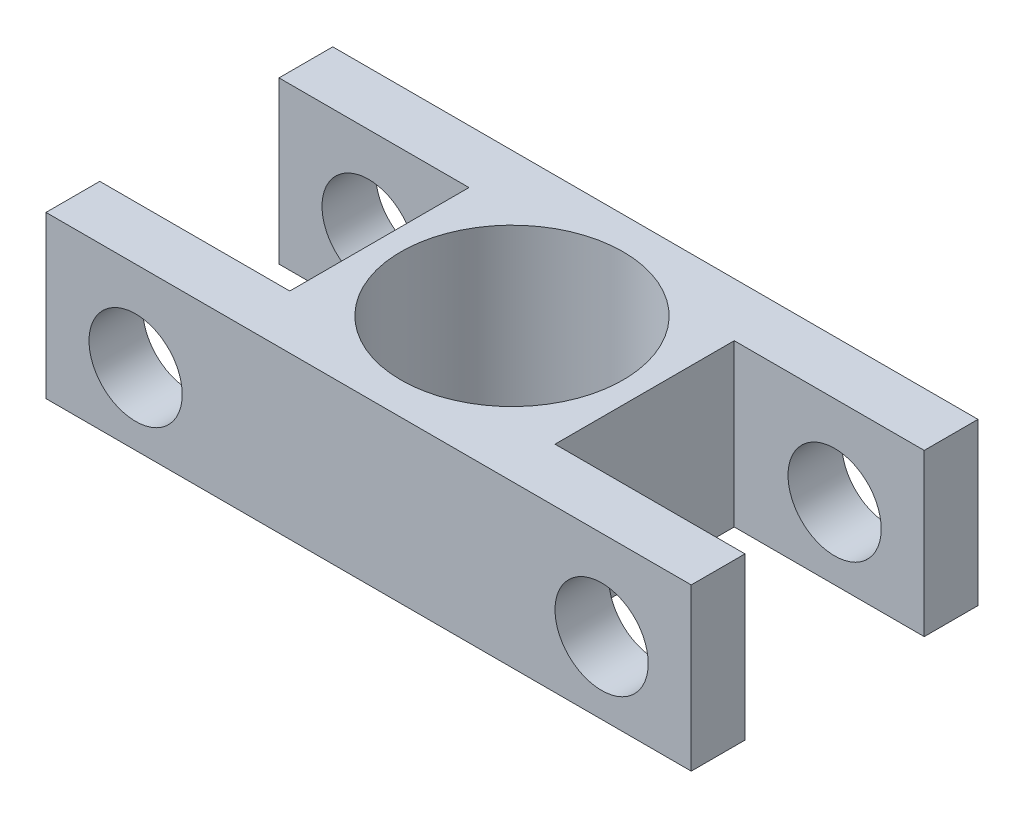
ISO-10303-21;
HEADER;
FILE_DESCRIPTION(('STEP AP214'),'2;1');
FILE_NAME('part.step','',(''),(''),'','','');
FILE_SCHEMA(('AUTOMOTIVE_DESIGN { 1 0 10303 214 1 1 1 1 }'));
ENDSEC;
DATA;
#1=APPLICATION_CONTEXT('core data for automotive mechanical design processes');
#2=APPLICATION_PROTOCOL_DEFINITION('international standard','automotive_design',2000,#1);
#3=PRODUCT_CONTEXT('',#1,'mechanical');
#4=PRODUCT('Part','Part','',(#3));
#5=PRODUCT_RELATED_PRODUCT_CATEGORY('part','',(#4));
#6=PRODUCT_DEFINITION_FORMATION('','',#4);
#7=PRODUCT_DEFINITION_CONTEXT('part definition',#1,'design');
#8=PRODUCT_DEFINITION('design','',#6,#7);
#9=PRODUCT_DEFINITION_SHAPE('','',#8);
#10=(LENGTH_UNIT() NAMED_UNIT(*) SI_UNIT(.MILLI.,.METRE.));
#11=(NAMED_UNIT(*) PLANE_ANGLE_UNIT() SI_UNIT($,.RADIAN.));
#12=(NAMED_UNIT(*) SI_UNIT($,.STERADIAN.) SOLID_ANGLE_UNIT());
#13=UNCERTAINTY_MEASURE_WITH_UNIT(LENGTH_MEASURE(1.E-05),#10,'distance_accuracy_value','');
#14=(GEOMETRIC_REPRESENTATION_CONTEXT(3) GLOBAL_UNCERTAINTY_ASSIGNED_CONTEXT((#13)) GLOBAL_UNIT_ASSIGNED_CONTEXT((#10,
#11,#12)) REPRESENTATION_CONTEXT('',''));
#15=CARTESIAN_POINT('',(0.,0.,0.));
#16=DIRECTION('',(0.,0.,1.));
#17=DIRECTION('',(1.,0.,0.));
#18=AXIS2_PLACEMENT_3D('',#15,#16,#17);
#19=CARTESIAN_POINT('',(0.,0.,16.));
#20=DIRECTION('',(0.,1.,0.));
#21=DIRECTION('',(0.,0.,1.));
#22=AXIS2_PLACEMENT_3D('',#19,#20,#21);
#23=PLANE('',#22);
#24=CARTESIAN_POINT('',(18.,0.,8.));
#25=DIRECTION('',(0.,1.,0.));
#26=DIRECTION('',(0.,0.,1.));
#27=AXIS2_PLACEMENT_3D('',#24,#25,#26);
#28=CIRCLE('',#27,6.2);
#29=CARTESIAN_POINT('',(18.,0.,14.2));
#30=VERTEX_POINT('',#29);
#31=EDGE_CURVE('E241',#30,#30,#28,.T.);
#32=ORIENTED_EDGE('',*,*,#31,.T.);
#33=EDGE_LOOP('',(#32));
#34=FACE_BOUND('',#33,.T.);
#35=DIRECTION('',(1.,0.,0.));
#36=VECTOR('',#35,1.);
#37=CARTESIAN_POINT('',(0.,0.,3.));
#38=LINE('',#37,#36);
#39=CARTESIAN_POINT('',(25.4,0.,3.));
#40=VERTEX_POINT('',#39);
#41=CARTESIAN_POINT('',(36.,0.,3.));
#42=VERTEX_POINT('',#41);
#43=EDGE_CURVE('E154',#40,#42,#38,.T.);
#44=ORIENTED_EDGE('',*,*,#43,.F.);
#45=DIRECTION('',(0.,0.,1.));
#46=VECTOR('',#45,1.);
#47=CARTESIAN_POINT('',(25.4,0.,16.));
#48=LINE('',#47,#46);
#49=CARTESIAN_POINT('',(25.4,0.,13.));
#50=VERTEX_POINT('',#49);
#51=EDGE_CURVE('E156',#40,#50,#48,.T.);
#52=ORIENTED_EDGE('',*,*,#51,.T.);
#53=DIRECTION('',(1.,0.,0.));
#54=VECTOR('',#53,1.);
#55=CARTESIAN_POINT('',(0.,0.,13.));
#56=LINE('',#55,#54);
#57=CARTESIAN_POINT('',(36.,0.,13.));
#58=VERTEX_POINT('',#57);
#59=EDGE_CURVE('E140',#50,#58,#56,.T.);
#60=ORIENTED_EDGE('',*,*,#59,.T.);
#61=DIRECTION('',(0.,0.,-1.));
#62=VECTOR('',#61,1.);
#63=CARTESIAN_POINT('',(36.,0.,16.));
#64=LINE('',#63,#62);
#65=CARTESIAN_POINT('',(36.,0.,16.));
#66=VERTEX_POINT('',#65);
#67=EDGE_CURVE('E203',#66,#58,#64,.T.);
#68=ORIENTED_EDGE('',*,*,#67,.F.);
#69=DIRECTION('',(1.,0.,0.));
#70=VECTOR('',#69,1.);
#71=CARTESIAN_POINT('',(0.,0.,16.));
#72=LINE('',#71,#70);
#73=CARTESIAN_POINT('',(0.,0.,16.));
#74=VERTEX_POINT('',#73);
#75=EDGE_CURVE('E179',#74,#66,#72,.T.);
#76=ORIENTED_EDGE('',*,*,#75,.F.);
#77=DIRECTION('',(0.,0.,-1.));
#78=VECTOR('',#77,1.);
#79=CARTESIAN_POINT('',(0.,0.,16.));
#80=LINE('',#79,#78);
#81=CARTESIAN_POINT('',(0.,0.,13.));
#82=VERTEX_POINT('',#81);
#83=EDGE_CURVE('E207',#74,#82,#80,.T.);
#84=ORIENTED_EDGE('',*,*,#83,.T.);
#85=DIRECTION('',(1.,0.,0.));
#86=VECTOR('',#85,1.);
#87=CARTESIAN_POINT('',(0.,0.,13.));
#88=LINE('',#87,#86);
#89=CARTESIAN_POINT('',(10.6,0.,13.));
#90=VERTEX_POINT('',#89);
#91=EDGE_CURVE('E165',#82,#90,#88,.T.);
#92=ORIENTED_EDGE('',*,*,#91,.T.);
#93=DIRECTION('',(0.,0.,-1.));
#94=VECTOR('',#93,1.);
#95=CARTESIAN_POINT('',(10.6,0.,16.));
#96=LINE('',#95,#94);
#97=CARTESIAN_POINT('',(10.6,0.,3.));
#98=VERTEX_POINT('',#97);
#99=EDGE_CURVE('E172',#90,#98,#96,.T.);
#100=ORIENTED_EDGE('',*,*,#99,.T.);
#101=DIRECTION('',(1.,0.,0.));
#102=VECTOR('',#101,1.);
#103=CARTESIAN_POINT('',(0.,0.,3.));
#104=LINE('',#103,#102);
#105=CARTESIAN_POINT('',(0.,0.,3.));
#106=VERTEX_POINT('',#105);
#107=EDGE_CURVE('E170',#106,#98,#104,.T.);
#108=ORIENTED_EDGE('',*,*,#107,.F.);
#109=CARTESIAN_POINT('',(0.,0.,0.));
#110=VERTEX_POINT('',#109);
#111=EDGE_CURVE('E206',#106,#110,#80,.T.);
#112=ORIENTED_EDGE('',*,*,#111,.T.);
#113=DIRECTION('',(1.,0.,0.));
#114=VECTOR('',#113,1.);
#115=CARTESIAN_POINT('',(0.,0.,0.));
#116=LINE('',#115,#114);
#117=CARTESIAN_POINT('',(36.,0.,0.));
#118=VERTEX_POINT('',#117);
#119=EDGE_CURVE('E189',#110,#118,#116,.T.);
#120=ORIENTED_EDGE('',*,*,#119,.T.);
#121=EDGE_CURVE('E202',#42,#118,#64,.T.);
#122=ORIENTED_EDGE('',*,*,#121,.F.);
#123=EDGE_LOOP('',(#44,#52,#60,#68,#76,#84,#92,#100,#108,#112,#120,#122));
#124=FACE_BOUND('',#123,.T.);
#125=ADVANCED_FACE('F39',(#34,#124),#23,.F.);
#126=CARTESIAN_POINT('',(36.,9.,16.));
#127=DIRECTION('',(0.,-1.,0.));
#128=DIRECTION('',(0.,0.,-1.));
#129=AXIS2_PLACEMENT_3D('',#126,#127,#128);
#130=PLANE('',#129);
#131=CARTESIAN_POINT('',(18.,9.,8.));
#132=DIRECTION('',(0.,1.,0.));
#133=DIRECTION('',(0.,0.,1.));
#134=AXIS2_PLACEMENT_3D('',#131,#132,#133);
#135=CIRCLE('',#134,6.2);
#136=CARTESIAN_POINT('',(18.,9.,14.2));
#137=VERTEX_POINT('',#136);
#138=EDGE_CURVE('E244',#137,#137,#135,.T.);
#139=ORIENTED_EDGE('',*,*,#138,.F.);
#140=EDGE_LOOP('',(#139));
#141=FACE_BOUND('',#140,.T.);
#142=DIRECTION('',(-1.,0.,0.));
#143=VECTOR('',#142,1.);
#144=CARTESIAN_POINT('',(36.,9.,3.));
#145=LINE('',#144,#143);
#146=CARTESIAN_POINT('',(36.,9.,3.));
#147=VERTEX_POINT('',#146);
#148=CARTESIAN_POINT('',(25.4,9.,3.));
#149=VERTEX_POINT('',#148);
#150=EDGE_CURVE('E149',#147,#149,#145,.T.);
#151=ORIENTED_EDGE('',*,*,#150,.F.);
#152=DIRECTION('',(0.,0.,-1.));
#153=VECTOR('',#152,1.);
#154=CARTESIAN_POINT('',(36.,9.,16.));
#155=LINE('',#154,#153);
#156=CARTESIAN_POINT('',(36.,9.,0.));
#157=VERTEX_POINT('',#156);
#158=EDGE_CURVE('E200',#147,#157,#155,.T.);
#159=ORIENTED_EDGE('',*,*,#158,.T.);
#160=DIRECTION('',(-1.,0.,0.));
#161=VECTOR('',#160,1.);
#162=CARTESIAN_POINT('',(36.,9.,0.));
#163=LINE('',#162,#161);
#164=CARTESIAN_POINT('',(0.,9.,0.));
#165=VERTEX_POINT('',#164);
#166=EDGE_CURVE('E180',#157,#165,#163,.T.);
#167=ORIENTED_EDGE('',*,*,#166,.T.);
#168=DIRECTION('',(0.,0.,-1.));
#169=VECTOR('',#168,1.);
#170=CARTESIAN_POINT('',(0.,9.,16.));
#171=LINE('',#170,#169);
#172=CARTESIAN_POINT('',(0.,9.,3.));
#173=VERTEX_POINT('',#172);
#174=EDGE_CURVE('E186',#173,#165,#171,.T.);
#175=ORIENTED_EDGE('',*,*,#174,.F.);
#176=DIRECTION('',(-1.,0.,0.));
#177=VECTOR('',#176,1.);
#178=CARTESIAN_POINT('',(36.,9.,3.));
#179=LINE('',#178,#177);
#180=CARTESIAN_POINT('',(10.6,9.,3.));
#181=VERTEX_POINT('',#180);
#182=EDGE_CURVE('E215',#181,#173,#179,.T.);
#183=ORIENTED_EDGE('',*,*,#182,.F.);
#184=DIRECTION('',(0.,0.,1.));
#185=VECTOR('',#184,1.);
#186=CARTESIAN_POINT('',(10.6,9.,16.));
#187=LINE('',#186,#185);
#188=CARTESIAN_POINT('',(10.6,9.,13.));
#189=VERTEX_POINT('',#188);
#190=EDGE_CURVE('E212',#181,#189,#187,.T.);
#191=ORIENTED_EDGE('',*,*,#190,.T.);
#192=DIRECTION('',(-1.,0.,0.));
#193=VECTOR('',#192,1.);
#194=CARTESIAN_POINT('',(36.,9.,13.));
#195=LINE('',#194,#193);
#196=CARTESIAN_POINT('',(0.,9.,13.));
#197=VERTEX_POINT('',#196);
#198=EDGE_CURVE('E210',#189,#197,#195,.T.);
#199=ORIENTED_EDGE('',*,*,#198,.T.);
#200=CARTESIAN_POINT('',(0.,9.,16.));
#201=VERTEX_POINT('',#200);
#202=EDGE_CURVE('E197',#201,#197,#171,.T.);
#203=ORIENTED_EDGE('',*,*,#202,.F.);
#204=DIRECTION('',(-1.,0.,0.));
#205=VECTOR('',#204,1.);
#206=CARTESIAN_POINT('',(36.,9.,16.));
#207=LINE('',#206,#205);
#208=CARTESIAN_POINT('',(36.,9.,16.));
#209=VERTEX_POINT('',#208);
#210=EDGE_CURVE('E184',#209,#201,#207,.T.);
#211=ORIENTED_EDGE('',*,*,#210,.F.);
#212=CARTESIAN_POINT('',(36.,9.,13.));
#213=VERTEX_POINT('',#212);
#214=EDGE_CURVE('E147',#209,#213,#155,.T.);
#215=ORIENTED_EDGE('',*,*,#214,.T.);
#216=DIRECTION('',(-1.,0.,0.));
#217=VECTOR('',#216,1.);
#218=CARTESIAN_POINT('',(36.,9.,13.));
#219=LINE('',#218,#217);
#220=CARTESIAN_POINT('',(25.4,9.,13.));
#221=VERTEX_POINT('',#220);
#222=EDGE_CURVE('E56',#213,#221,#219,.T.);
#223=ORIENTED_EDGE('',*,*,#222,.T.);
#224=DIRECTION('',(0.,0.,-1.));
#225=VECTOR('',#224,1.);
#226=CARTESIAN_POINT('',(25.4,9.,16.));
#227=LINE('',#226,#225);
#228=EDGE_CURVE('E11',#221,#149,#227,.T.);
#229=ORIENTED_EDGE('',*,*,#228,.T.);
#230=EDGE_LOOP('',(#151,#159,#167,#175,#183,#191,#199,#203,#211,#215,#223,#229));
#231=FACE_BOUND('',#230,.T.);
#232=ADVANCED_FACE('F144',(#141,#231),#130,.F.);
#233=CARTESIAN_POINT('',(36.,0.,16.));
#234=DIRECTION('',(-1.,0.,0.));
#235=DIRECTION('',(0.,0.,1.));
#236=AXIS2_PLACEMENT_3D('',#233,#234,#235);
#237=PLANE('',#236);
#238=DIRECTION('',(0.,1.,0.));
#239=VECTOR('',#238,1.);
#240=CARTESIAN_POINT('',(36.,0.,3.));
#241=LINE('',#240,#239);
#242=EDGE_CURVE('E48',#42,#147,#241,.T.);
#243=ORIENTED_EDGE('',*,*,#242,.F.);
#244=ORIENTED_EDGE('',*,*,#121,.T.);
#245=DIRECTION('',(0.,1.,0.));
#246=VECTOR('',#245,1.);
#247=CARTESIAN_POINT('',(36.,0.,0.));
#248=LINE('',#247,#246);
#249=EDGE_CURVE('E192',#118,#157,#248,.T.);
#250=ORIENTED_EDGE('',*,*,#249,.T.);
#251=ORIENTED_EDGE('',*,*,#158,.F.);
#252=EDGE_LOOP('',(#243,#244,#250,#251));
#253=FACE_BOUND('',#252,.T.);
#254=ADVANCED_FACE('F260',(#253),#237,.F.);
#255=CARTESIAN_POINT('',(0.,9.,16.));
#256=DIRECTION('',(1.,0.,0.));
#257=DIRECTION('',(0.,0.,-1.));
#258=AXIS2_PLACEMENT_3D('',#255,#256,#257);
#259=PLANE('',#258);
#260=DIRECTION('',(0.,-1.,0.));
#261=VECTOR('',#260,1.);
#262=CARTESIAN_POINT('',(0.,9.,3.));
#263=LINE('',#262,#261);
#264=EDGE_CURVE('E168',#173,#106,#263,.T.);
#265=ORIENTED_EDGE('',*,*,#264,.F.);
#266=ORIENTED_EDGE('',*,*,#174,.T.);
#267=DIRECTION('',(0.,-1.,0.));
#268=VECTOR('',#267,1.);
#269=CARTESIAN_POINT('',(0.,9.,0.));
#270=LINE('',#269,#268);
#271=EDGE_CURVE('E175',#165,#110,#270,.T.);
#272=ORIENTED_EDGE('',*,*,#271,.T.);
#273=ORIENTED_EDGE('',*,*,#111,.F.);
#274=EDGE_LOOP('',(#265,#266,#272,#273));
#275=FACE_BOUND('',#274,.T.);
#276=ADVANCED_FACE('F266',(#275),#259,.F.);
#277=ORIENTED_EDGE('',*,*,#202,.T.);
#278=DIRECTION('',(0.,-1.,0.));
#279=VECTOR('',#278,1.);
#280=CARTESIAN_POINT('',(0.,9.,13.));
#281=LINE('',#280,#279);
#282=EDGE_CURVE('E64',#197,#82,#281,.T.);
#283=ORIENTED_EDGE('',*,*,#282,.T.);
#284=ORIENTED_EDGE('',*,*,#83,.F.);
#285=DIRECTION('',(0.,-1.,0.));
#286=VECTOR('',#285,1.);
#287=CARTESIAN_POINT('',(0.,9.,16.));
#288=LINE('',#287,#286);
#289=EDGE_CURVE('E176',#201,#74,#288,.T.);
#290=ORIENTED_EDGE('',*,*,#289,.F.);
#291=EDGE_LOOP('',(#277,#283,#284,#290));
#292=FACE_BOUND('',#291,.T.);
#293=ADVANCED_FACE('F41',(#292),#259,.F.);
#294=ORIENTED_EDGE('',*,*,#67,.T.);
#295=DIRECTION('',(0.,1.,0.));
#296=VECTOR('',#295,1.);
#297=CARTESIAN_POINT('',(36.,0.,13.));
#298=LINE('',#297,#296);
#299=EDGE_CURVE('E217',#58,#213,#298,.T.);
#300=ORIENTED_EDGE('',*,*,#299,.T.);
#301=ORIENTED_EDGE('',*,*,#214,.F.);
#302=DIRECTION('',(0.,1.,0.));
#303=VECTOR('',#302,1.);
#304=CARTESIAN_POINT('',(36.,0.,16.));
#305=LINE('',#304,#303);
#306=EDGE_CURVE('E182',#66,#209,#305,.T.);
#307=ORIENTED_EDGE('',*,*,#306,.F.);
#308=EDGE_LOOP('',(#294,#300,#301,#307));
#309=FACE_BOUND('',#308,.T.);
#310=ADVANCED_FACE('F269',(#309),#237,.F.);
#311=CARTESIAN_POINT('',(0.,0.,16.));
#312=DIRECTION('',(0.,0.,1.));
#313=DIRECTION('',(1.,0.,0.));
#314=AXIS2_PLACEMENT_3D('',#311,#312,#313);
#315=PLANE('',#314);
#316=CARTESIAN_POINT('',(31.,4.,16.));
#317=DIRECTION('',(0.,0.,1.));
#318=DIRECTION('',(1.,0.,0.));
#319=AXIS2_PLACEMENT_3D('',#316,#317,#318);
#320=CIRCLE('',#319,2.6);
#321=CARTESIAN_POINT('',(33.6,4.,16.));
#322=VERTEX_POINT('',#321);
#323=EDGE_CURVE('E237',#322,#322,#320,.T.);
#324=ORIENTED_EDGE('',*,*,#323,.F.);
#325=EDGE_LOOP('',(#324));
#326=FACE_BOUND('',#325,.T.);
#327=CARTESIAN_POINT('',(5.,4.,16.));
#328=DIRECTION('',(0.,0.,1.));
#329=DIRECTION('',(1.,0.,0.));
#330=AXIS2_PLACEMENT_3D('',#327,#328,#329);
#331=CIRCLE('',#330,2.6);
#332=CARTESIAN_POINT('',(7.6,4.,16.));
#333=VERTEX_POINT('',#332);
#334=EDGE_CURVE('E227',#333,#333,#331,.T.);
#335=ORIENTED_EDGE('',*,*,#334,.F.);
#336=EDGE_LOOP('',(#335));
#337=FACE_BOUND('',#336,.T.);
#338=ORIENTED_EDGE('',*,*,#289,.T.);
#339=ORIENTED_EDGE('',*,*,#75,.T.);
#340=ORIENTED_EDGE('',*,*,#306,.T.);
#341=ORIENTED_EDGE('',*,*,#210,.T.);
#342=EDGE_LOOP('',(#338,#339,#340,#341));
#343=FACE_BOUND('',#342,.T.);
#344=ADVANCED_FACE('F274',(#326,#337,#343),#315,.T.);
#345=CARTESIAN_POINT('',(0.,0.,0.));
#346=DIRECTION('',(0.,0.,1.));
#347=DIRECTION('',(1.,0.,0.));
#348=AXIS2_PLACEMENT_3D('',#345,#346,#347);
#349=PLANE('',#348);
#350=CARTESIAN_POINT('',(31.,4.,0.));
#351=DIRECTION('',(0.,0.,1.));
#352=DIRECTION('',(1.,0.,0.));
#353=AXIS2_PLACEMENT_3D('',#350,#351,#352);
#354=CIRCLE('',#353,2.6);
#355=CARTESIAN_POINT('',(33.6,4.,0.));
#356=VERTEX_POINT('',#355);
#357=EDGE_CURVE('E240',#356,#356,#354,.T.);
#358=ORIENTED_EDGE('',*,*,#357,.T.);
#359=EDGE_LOOP('',(#358));
#360=FACE_BOUND('',#359,.T.);
#361=CARTESIAN_POINT('',(5.,4.,0.));
#362=DIRECTION('',(0.,0.,1.));
#363=DIRECTION('',(1.,0.,0.));
#364=AXIS2_PLACEMENT_3D('',#361,#362,#363);
#365=CIRCLE('',#364,2.6);
#366=CARTESIAN_POINT('',(7.6,4.,0.));
#367=VERTEX_POINT('',#366);
#368=EDGE_CURVE('E221',#367,#367,#365,.T.);
#369=ORIENTED_EDGE('',*,*,#368,.T.);
#370=EDGE_LOOP('',(#369));
#371=FACE_BOUND('',#370,.T.);
#372=ORIENTED_EDGE('',*,*,#271,.F.);
#373=ORIENTED_EDGE('',*,*,#166,.F.);
#374=ORIENTED_EDGE('',*,*,#249,.F.);
#375=ORIENTED_EDGE('',*,*,#119,.F.);
#376=EDGE_LOOP('',(#372,#373,#374,#375));
#377=FACE_BOUND('',#376,.T.);
#378=ADVANCED_FACE('F271',(#360,#371,#377),#349,.F.);
#379=CARTESIAN_POINT('',(10.6,-2.,3.));
#380=DIRECTION('',(1.,0.,0.));
#381=DIRECTION('',(0.,0.,-1.));
#382=AXIS2_PLACEMENT_3D('',#379,#380,#381);
#383=PLANE('',#382);
#384=DIRECTION('',(0.,1.,0.));
#385=VECTOR('',#384,1.);
#386=CARTESIAN_POINT('',(10.6,-2.,13.));
#387=LINE('',#386,#385);
#388=EDGE_CURVE('E158',#90,#189,#387,.T.);
#389=ORIENTED_EDGE('',*,*,#388,.T.);
#390=ORIENTED_EDGE('',*,*,#190,.F.);
#391=DIRECTION('',(0.,1.,0.));
#392=VECTOR('',#391,1.);
#393=CARTESIAN_POINT('',(10.6,-2.,3.));
#394=LINE('',#393,#392);
#395=EDGE_CURVE('E159',#98,#181,#394,.T.);
#396=ORIENTED_EDGE('',*,*,#395,.F.);
#397=ORIENTED_EDGE('',*,*,#99,.F.);
#398=EDGE_LOOP('',(#389,#390,#396,#397));
#399=FACE_BOUND('',#398,.T.);
#400=ADVANCED_FACE('F306',(#399),#383,.F.);
#401=CARTESIAN_POINT('',(0.,0.,3.));
#402=DIRECTION('',(0.,0.,1.));
#403=DIRECTION('',(1.,0.,0.));
#404=AXIS2_PLACEMENT_3D('',#401,#402,#403);
#405=PLANE('',#404);
#406=CARTESIAN_POINT('',(5.,4.,3.));
#407=DIRECTION('',(0.,0.,1.));
#408=DIRECTION('',(1.,0.,0.));
#409=AXIS2_PLACEMENT_3D('',#406,#407,#408);
#410=CIRCLE('',#409,2.6);
#411=CARTESIAN_POINT('',(7.6,4.,3.));
#412=VERTEX_POINT('',#411);
#413=EDGE_CURVE('E141',#412,#412,#410,.T.);
#414=ORIENTED_EDGE('',*,*,#413,.F.);
#415=EDGE_LOOP('',(#414));
#416=FACE_BOUND('',#415,.T.);
#417=ORIENTED_EDGE('',*,*,#107,.T.);
#418=ORIENTED_EDGE('',*,*,#395,.T.);
#419=ORIENTED_EDGE('',*,*,#182,.T.);
#420=ORIENTED_EDGE('',*,*,#264,.T.);
#421=EDGE_LOOP('',(#417,#418,#419,#420));
#422=FACE_BOUND('',#421,.T.);
#423=ADVANCED_FACE('F302',(#416,#422),#405,.T.);
#424=CARTESIAN_POINT('',(0.,0.,13.));
#425=DIRECTION('',(0.,0.,1.));
#426=DIRECTION('',(1.,0.,0.));
#427=AXIS2_PLACEMENT_3D('',#424,#425,#426);
#428=PLANE('',#427);
#429=CARTESIAN_POINT('',(5.,4.,13.));
#430=DIRECTION('',(0.,0.,1.));
#431=DIRECTION('',(1.,0.,0.));
#432=AXIS2_PLACEMENT_3D('',#429,#430,#431);
#433=CIRCLE('',#432,2.6);
#434=CARTESIAN_POINT('',(7.6,4.,13.));
#435=VERTEX_POINT('',#434);
#436=EDGE_CURVE('E219',#435,#435,#433,.T.);
#437=ORIENTED_EDGE('',*,*,#436,.T.);
#438=EDGE_LOOP('',(#437));
#439=FACE_BOUND('',#438,.T.);
#440=ORIENTED_EDGE('',*,*,#282,.F.);
#441=ORIENTED_EDGE('',*,*,#198,.F.);
#442=ORIENTED_EDGE('',*,*,#388,.F.);
#443=ORIENTED_EDGE('',*,*,#91,.F.);
#444=EDGE_LOOP('',(#440,#441,#442,#443));
#445=FACE_BOUND('',#444,.T.);
#446=ADVANCED_FACE('F307',(#439,#445),#428,.F.);
#447=CARTESIAN_POINT('',(25.4,11.,3.));
#448=DIRECTION('',(-1.,0.,0.));
#449=DIRECTION('',(0.,0.,1.));
#450=AXIS2_PLACEMENT_3D('',#447,#448,#449);
#451=PLANE('',#450);
#452=DIRECTION('',(0.,-1.,0.));
#453=VECTOR('',#452,1.);
#454=CARTESIAN_POINT('',(25.4,11.,3.));
#455=LINE('',#454,#453);
#456=EDGE_CURVE('E135',#149,#40,#455,.T.);
#457=ORIENTED_EDGE('',*,*,#456,.F.);
#458=ORIENTED_EDGE('',*,*,#228,.F.);
#459=DIRECTION('',(0.,-1.,0.));
#460=VECTOR('',#459,1.);
#461=CARTESIAN_POINT('',(25.4,11.,13.));
#462=LINE('',#461,#460);
#463=EDGE_CURVE('E132',#221,#50,#462,.T.);
#464=ORIENTED_EDGE('',*,*,#463,.T.);
#465=ORIENTED_EDGE('',*,*,#51,.F.);
#466=EDGE_LOOP('',(#457,#458,#464,#465));
#467=FACE_BOUND('',#466,.T.);
#468=ADVANCED_FACE('F131',(#467),#451,.F.);
#469=CARTESIAN_POINT('',(0.,0.,3.));
#470=DIRECTION('',(0.,0.,1.));
#471=DIRECTION('',(1.,0.,0.));
#472=AXIS2_PLACEMENT_3D('',#469,#470,#471);
#473=PLANE('',#472);
#474=CARTESIAN_POINT('',(31.,4.,3.));
#475=DIRECTION('',(0.,0.,1.));
#476=DIRECTION('',(1.,0.,0.));
#477=AXIS2_PLACEMENT_3D('',#474,#475,#476);
#478=CIRCLE('',#477,2.6);
#479=CARTESIAN_POINT('',(33.6,4.,3.));
#480=VERTEX_POINT('',#479);
#481=EDGE_CURVE('E232',#480,#480,#478,.T.);
#482=ORIENTED_EDGE('',*,*,#481,.F.);
#483=EDGE_LOOP('',(#482));
#484=FACE_BOUND('',#483,.T.);
#485=ORIENTED_EDGE('',*,*,#43,.T.);
#486=ORIENTED_EDGE('',*,*,#242,.T.);
#487=ORIENTED_EDGE('',*,*,#150,.T.);
#488=ORIENTED_EDGE('',*,*,#456,.T.);
#489=EDGE_LOOP('',(#485,#486,#487,#488));
#490=FACE_BOUND('',#489,.T.);
#491=ADVANCED_FACE('F287',(#484,#490),#473,.T.);
#492=CARTESIAN_POINT('',(0.,0.,13.));
#493=DIRECTION('',(0.,0.,1.));
#494=DIRECTION('',(1.,0.,0.));
#495=AXIS2_PLACEMENT_3D('',#492,#493,#494);
#496=PLANE('',#495);
#497=CARTESIAN_POINT('',(31.,4.,13.));
#498=DIRECTION('',(0.,0.,1.));
#499=DIRECTION('',(1.,0.,0.));
#500=AXIS2_PLACEMENT_3D('',#497,#498,#499);
#501=CIRCLE('',#500,2.6);
#502=CARTESIAN_POINT('',(33.6,4.,13.));
#503=VERTEX_POINT('',#502);
#504=EDGE_CURVE('E43',#503,#503,#501,.T.);
#505=ORIENTED_EDGE('',*,*,#504,.T.);
#506=EDGE_LOOP('',(#505));
#507=FACE_BOUND('',#506,.T.);
#508=ORIENTED_EDGE('',*,*,#463,.F.);
#509=ORIENTED_EDGE('',*,*,#222,.F.);
#510=ORIENTED_EDGE('',*,*,#299,.F.);
#511=ORIENTED_EDGE('',*,*,#59,.F.);
#512=EDGE_LOOP('',(#508,#509,#510,#511));
#513=FACE_BOUND('',#512,.T.);
#514=ADVANCED_FACE('F138',(#507,#513),#496,.F.);
#515=CARTESIAN_POINT('',(5.,4.,0.));
#516=DIRECTION('',(0.,0.,1.));
#517=DIRECTION('',(1.,0.,0.));
#518=AXIS2_PLACEMENT_3D('',#515,#516,#517);
#519=CYLINDRICAL_SURFACE('',#518,2.6);
#520=ORIENTED_EDGE('',*,*,#334,.T.);
#521=EDGE_LOOP('',(#520));
#522=FACE_BOUND('',#521,.T.);
#523=ORIENTED_EDGE('',*,*,#436,.F.);
#524=EDGE_LOOP('',(#523));
#525=FACE_BOUND('',#524,.T.);
#526=ADVANCED_FACE('F343',(#522,#525),#519,.F.);
#527=ORIENTED_EDGE('',*,*,#413,.T.);
#528=EDGE_LOOP('',(#527));
#529=FACE_BOUND('',#528,.T.);
#530=ORIENTED_EDGE('',*,*,#368,.F.);
#531=EDGE_LOOP('',(#530));
#532=FACE_BOUND('',#531,.T.);
#533=ADVANCED_FACE('F338',(#529,#532),#519,.F.);
#534=CARTESIAN_POINT('',(31.,4.,0.));
#535=DIRECTION('',(0.,0.,1.));
#536=DIRECTION('',(1.,0.,0.));
#537=AXIS2_PLACEMENT_3D('',#534,#535,#536);
#538=CYLINDRICAL_SURFACE('',#537,2.6);
#539=ORIENTED_EDGE('',*,*,#323,.T.);
#540=EDGE_LOOP('',(#539));
#541=FACE_BOUND('',#540,.T.);
#542=ORIENTED_EDGE('',*,*,#504,.F.);
#543=EDGE_LOOP('',(#542));
#544=FACE_BOUND('',#543,.T.);
#545=ADVANCED_FACE('F332',(#541,#544),#538,.F.);
#546=ORIENTED_EDGE('',*,*,#481,.T.);
#547=EDGE_LOOP('',(#546));
#548=FACE_BOUND('',#547,.T.);
#549=ORIENTED_EDGE('',*,*,#357,.F.);
#550=EDGE_LOOP('',(#549));
#551=FACE_BOUND('',#550,.T.);
#552=ADVANCED_FACE('F255',(#548,#551),#538,.F.);
#553=CARTESIAN_POINT('',(18.,0.,8.));
#554=DIRECTION('',(0.,1.,0.));
#555=DIRECTION('',(0.,0.,1.));
#556=AXIS2_PLACEMENT_3D('',#553,#554,#555);
#557=CYLINDRICAL_SURFACE('',#556,6.2);
#558=ORIENTED_EDGE('',*,*,#31,.F.);
#559=EDGE_LOOP('',(#558));
#560=FACE_BOUND('',#559,.T.);
#561=ORIENTED_EDGE('',*,*,#138,.T.);
#562=EDGE_LOOP('',(#561));
#563=FACE_BOUND('',#562,.T.);
#564=ADVANCED_FACE('F252',(#560,#563),#557,.F.);
#565=CLOSED_SHELL('',(#125,#232,#254,#276,#293,#310,#344,#378,#400,#423,#446,#468,#491,#514,
#526,#533,#545,#552,#564));
#566=MANIFOLD_SOLID_BREP('B2',#565);
#567=ADVANCED_BREP_SHAPE_REPRESENTATION('',(#18,#566),#14);
#568=SHAPE_DEFINITION_REPRESENTATION(#9,#567);
ENDSEC;
END-ISO-10303-21;
